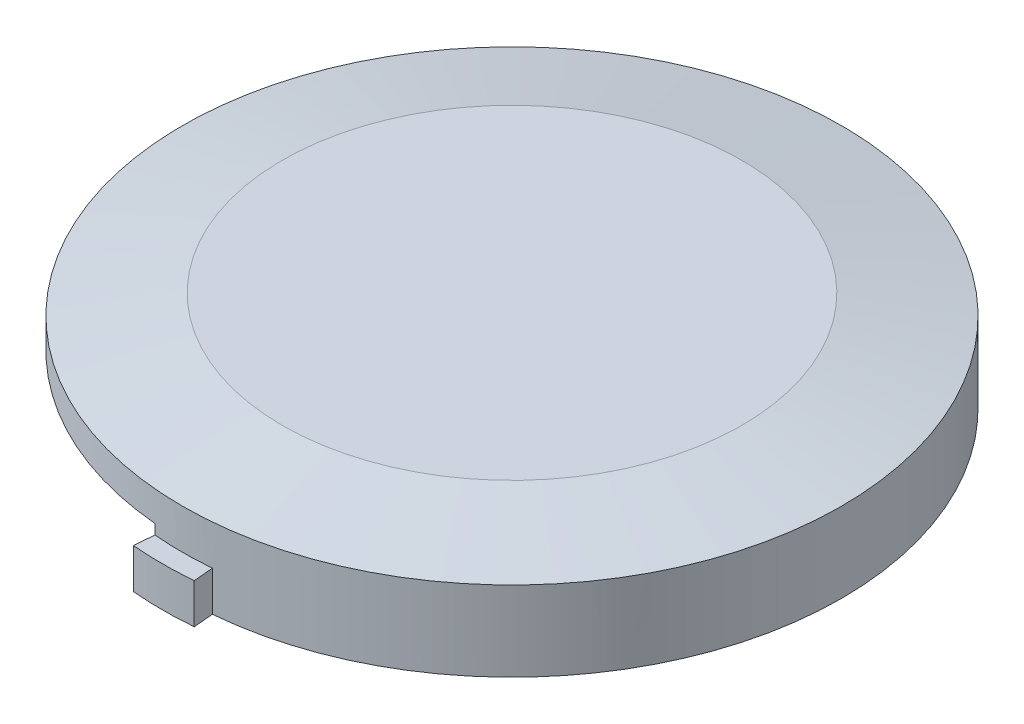
ISO-10303-21;
HEADER;
FILE_DESCRIPTION(('STEP AP214'),'2;1');
FILE_NAME('part.step','',(''),(''),'','','');
FILE_SCHEMA(('AUTOMOTIVE_DESIGN { 1 0 10303 214 1 1 1 1 }'));
ENDSEC;
DATA;
#1=APPLICATION_CONTEXT('core data for automotive mechanical design processes');
#2=APPLICATION_PROTOCOL_DEFINITION('international standard','automotive_design',2000,#1);
#3=PRODUCT_CONTEXT('',#1,'mechanical');
#4=PRODUCT('Part','Part','',(#3));
#5=PRODUCT_RELATED_PRODUCT_CATEGORY('part','',(#4));
#6=PRODUCT_DEFINITION_FORMATION('','',#4);
#7=PRODUCT_DEFINITION_CONTEXT('part definition',#1,'design');
#8=PRODUCT_DEFINITION('design','',#6,#7);
#9=PRODUCT_DEFINITION_SHAPE('','',#8);
#10=(LENGTH_UNIT() NAMED_UNIT(*) SI_UNIT(.MILLI.,.METRE.));
#11=(NAMED_UNIT(*) PLANE_ANGLE_UNIT() SI_UNIT($,.RADIAN.));
#12=(NAMED_UNIT(*) SI_UNIT($,.STERADIAN.) SOLID_ANGLE_UNIT());
#13=UNCERTAINTY_MEASURE_WITH_UNIT(LENGTH_MEASURE(1.E-05),#10,'distance_accuracy_value','');
#14=(GEOMETRIC_REPRESENTATION_CONTEXT(3) GLOBAL_UNCERTAINTY_ASSIGNED_CONTEXT((#13)) GLOBAL_UNIT_ASSIGNED_CONTEXT((#10,
#11,#12)) REPRESENTATION_CONTEXT('',''));
#15=CARTESIAN_POINT('',(0.,0.,0.));
#16=DIRECTION('',(0.,0.,1.));
#17=DIRECTION('',(1.,0.,0.));
#18=AXIS2_PLACEMENT_3D('',#15,#16,#17);
#19=CARTESIAN_POINT('',(0.,5.,0.));
#20=DIRECTION('',(0.,-1.,0.));
#21=DIRECTION('',(0.,0.,-1.));
#22=AXIS2_PLACEMENT_3D('',#19,#20,#21);
#23=CYLINDRICAL_SURFACE('',#22,16.5);
#24=CARTESIAN_POINT('',(0.,4.,0.));
#25=DIRECTION('',(0.,1.,0.));
#26=DIRECTION('',(0.,0.,1.));
#27=AXIS2_PLACEMENT_3D('',#24,#25,#26);
#28=CIRCLE('',#27,16.5);
#29=CARTESIAN_POINT('',(0.,4.,16.5));
#30=VERTEX_POINT('',#29);
#31=EDGE_CURVE('E207',#30,#30,#28,.F.);
#32=ORIENTED_EDGE('',*,*,#31,.T.);
#33=EDGE_LOOP('',(#32));
#34=FACE_BOUND('',#33,.T.);
#35=CARTESIAN_POINT('',(0.,2.5,0.));
#36=DIRECTION('',(0.,-1.,0.));
#37=DIRECTION('',(0.,0.,-1.));
#38=AXIS2_PLACEMENT_3D('',#35,#36,#37);
#39=CIRCLE('',#38,16.5);
#40=CARTESIAN_POINT('',(-1.43806975533631,2.5,16.4372125185138));
#41=VERTEX_POINT('',#40);
#42=CARTESIAN_POINT('',(-16.2493279247014,2.5,-2.86519493150436));
#43=VERTEX_POINT('',#42);
#44=EDGE_CURVE('E130',#41,#43,#39,.T.);
#45=ORIENTED_EDGE('',*,*,#44,.F.);
#46=DIRECTION('',(0.,-1.,0.));
#47=VECTOR('',#46,1.);
#48=CARTESIAN_POINT('',(-1.43806975533631,0.,16.4372125185138));
#49=LINE('',#48,#47);
#50=CARTESIAN_POINT('',(-1.43806975533631,2.,16.4372125185138));
#51=VERTEX_POINT('',#50);
#52=EDGE_CURVE('E136',#41,#51,#49,.T.);
#53=ORIENTED_EDGE('',*,*,#52,.T.);
#54=CARTESIAN_POINT('',(0.,2.,0.));
#55=DIRECTION('',(0.,-1.,0.));
#56=DIRECTION('',(0.,0.,-1.));
#57=AXIS2_PLACEMENT_3D('',#54,#55,#56);
#58=CIRCLE('',#57,16.5);
#59=CARTESIAN_POINT('',(1.43806975533636,1.99999999999999,16.4372125185138));
#60=VERTEX_POINT('',#59);
#61=EDGE_CURVE('E50',#60,#51,#58,.T.);
#62=ORIENTED_EDGE('',*,*,#61,.F.);
#63=DIRECTION('',(0.,1.,0.));
#64=VECTOR('',#63,1.);
#65=CARTESIAN_POINT('',(1.43806975533636,0.,16.4372125185138));
#66=LINE('',#65,#64);
#67=CARTESIAN_POINT('',(1.43806975533636,0.,16.4372125185138));
#68=VERTEX_POINT('',#67);
#69=EDGE_CURVE('E153',#68,#60,#66,.T.);
#70=ORIENTED_EDGE('',*,*,#69,.F.);
#71=CARTESIAN_POINT('',(0.,0.,0.));
#72=DIRECTION('',(0.,1.,0.));
#73=DIRECTION('',(0.,0.,1.));
#74=AXIS2_PLACEMENT_3D('',#71,#72,#73);
#75=CIRCLE('',#74,16.5);
#76=CARTESIAN_POINT('',(1.43806975533636,0.,-16.4372125185138));
#77=VERTEX_POINT('',#76);
#78=EDGE_CURVE('E200',#68,#77,#75,.T.);
#79=ORIENTED_EDGE('',*,*,#78,.T.);
#80=DIRECTION('',(0.,-1.,0.));
#81=VECTOR('',#80,1.);
#82=CARTESIAN_POINT('',(1.43806975533636,0.,-16.4372125185138));
#83=LINE('',#82,#81);
#84=CARTESIAN_POINT('',(1.43806975533636,2.,-16.4372125185138));
#85=VERTEX_POINT('',#84);
#86=EDGE_CURVE('E169',#85,#77,#83,.T.);
#87=ORIENTED_EDGE('',*,*,#86,.F.);
#88=CARTESIAN_POINT('',(0.,2.,0.));
#89=DIRECTION('',(0.,-1.,0.));
#90=DIRECTION('',(0.,0.,-1.));
#91=AXIS2_PLACEMENT_3D('',#88,#89,#90);
#92=CIRCLE('',#91,16.5);
#93=CARTESIAN_POINT('',(-1.43806975533636,2.,-16.4372125185138));
#94=VERTEX_POINT('',#93);
#95=EDGE_CURVE('E57',#94,#85,#92,.T.);
#96=ORIENTED_EDGE('',*,*,#95,.F.);
#97=DIRECTION('',(0.,-1.,0.));
#98=VECTOR('',#97,1.);
#99=CARTESIAN_POINT('',(-1.43806975533636,0.,-16.4372125185138));
#100=LINE('',#99,#98);
#101=CARTESIAN_POINT('',(-1.43806975533636,0.,-16.4372125185138));
#102=VERTEX_POINT('',#101);
#103=EDGE_CURVE('E181',#94,#102,#100,.T.);
#104=ORIENTED_EDGE('',*,*,#103,.T.);
#105=CARTESIAN_POINT('',(-16.2493279247014,0.,-2.86519493150436));
#106=VERTEX_POINT('',#105);
#107=EDGE_CURVE('E139',#102,#106,#75,.T.);
#108=ORIENTED_EDGE('',*,*,#107,.T.);
#109=DIRECTION('',(0.,-1.,0.));
#110=VECTOR('',#109,1.);
#111=CARTESIAN_POINT('',(-16.2493279247014,0.,-2.86519493150436));
#112=LINE('',#111,#110);
#113=EDGE_CURVE('E122',#43,#106,#112,.T.);
#114=ORIENTED_EDGE('',*,*,#113,.F.);
#115=EDGE_LOOP('',(#45,#53,#62,#70,#79,#87,#96,#104,#108,#114));
#116=FACE_BOUND('',#115,.T.);
#117=ADVANCED_FACE('F35',(#34,#116),#23,.T.);
#118=CARTESIAN_POINT('',(0.,5.,0.));
#119=DIRECTION('',(0.,1.,0.));
#120=DIRECTION('',(0.,0.,1.));
#121=AXIS2_PLACEMENT_3D('',#118,#119,#120);
#122=PLANE('',#121);
#123=CARTESIAN_POINT('',(0.,5.,0.));
#124=DIRECTION('',(0.,1.,0.));
#125=DIRECTION('',(0.,0.,1.));
#126=AXIS2_PLACEMENT_3D('',#123,#124,#125);
#127=CIRCLE('',#126,11.4999999999999);
#128=CARTESIAN_POINT('',(0.,5.,11.4999999999999));
#129=VERTEX_POINT('',#128);
#130=EDGE_CURVE('E204',#129,#129,#127,.T.);
#131=ORIENTED_EDGE('',*,*,#130,.T.);
#132=EDGE_LOOP('',(#131));
#133=FACE_BOUND('',#132,.T.);
#134=ADVANCED_FACE('F255',(#133),#122,.T.);
#135=CARTESIAN_POINT('',(0.,0.,0.));
#136=DIRECTION('',(0.,1.,0.));
#137=DIRECTION('',(0.,0.,1.));
#138=AXIS2_PLACEMENT_3D('',#135,#136,#137);
#139=PLANE('',#138);
#140=DIRECTION('',(0.0871557427476584,0.,-0.996194698091746));
#141=VECTOR('',#140,1.);
#142=CARTESIAN_POINT('',(-1.43806975533636,0.,16.4372125185138));
#143=LINE('',#142,#141);
#144=CARTESIAN_POINT('',(-1.52522549808402,0.,17.4334072166055));
#145=VERTEX_POINT('',#144);
#146=CARTESIAN_POINT('',(-1.17660252709334,0.,13.4486284242386));
#147=VERTEX_POINT('',#146);
#148=EDGE_CURVE('E151',#145,#147,#143,.T.);
#149=ORIENTED_EDGE('',*,*,#148,.T.);
#150=CARTESIAN_POINT('',(0.,0.,0.));
#151=DIRECTION('',(0.,1.,0.));
#152=DIRECTION('',(0.,0.,1.));
#153=AXIS2_PLACEMENT_3D('',#150,#151,#152);
#154=CIRCLE('',#153,13.5);
#155=CARTESIAN_POINT('',(-13.2949046656648,0.,-2.34425039850356));
#156=VERTEX_POINT('',#155);
#157=EDGE_CURVE('E196',#147,#156,#154,.T.);
#158=ORIENTED_EDGE('',*,*,#157,.T.);
#159=DIRECTION('',(0.984807753012208,0.,0.173648177666931));
#160=VECTOR('',#159,1.);
#161=CARTESIAN_POINT('',(0.,0.,0.));
#162=LINE('',#161,#160);
#163=EDGE_CURVE('E140',#106,#156,#162,.T.);
#164=ORIENTED_EDGE('',*,*,#163,.F.);
#165=ORIENTED_EDGE('',*,*,#107,.F.);
#166=DIRECTION('',(-0.0871557427476583,0.,-0.996194698091746));
#167=VECTOR('',#166,1.);
#168=CARTESIAN_POINT('',(-1.43806975533636,0.,-16.4372125185138));
#169=LINE('',#168,#167);
#170=CARTESIAN_POINT('',(-1.52522549808402,0.,-17.4334072166055));
#171=VERTEX_POINT('',#170);
#172=EDGE_CURVE('E183',#102,#171,#169,.T.);
#173=ORIENTED_EDGE('',*,*,#172,.T.);
#174=CARTESIAN_POINT('',(0.,0.,0.));
#175=DIRECTION('',(0.,-1.,0.));
#176=DIRECTION('',(0.,0.,-1.));
#177=AXIS2_PLACEMENT_3D('',#174,#175,#176);
#178=CIRCLE('',#177,17.5);
#179=CARTESIAN_POINT('',(1.52522549808402,0.,-17.4334072166055));
#180=VERTEX_POINT('',#179);
#181=EDGE_CURVE('E191',#171,#180,#178,.T.);
#182=ORIENTED_EDGE('',*,*,#181,.T.);
#183=DIRECTION('',(0.0871557427476584,0.,-0.996194698091746));
#184=VECTOR('',#183,1.);
#185=CARTESIAN_POINT('',(1.43806975533636,0.,-16.4372125185138));
#186=LINE('',#185,#184);
#187=EDGE_CURVE('E172',#77,#180,#186,.T.);
#188=ORIENTED_EDGE('',*,*,#187,.F.);
#189=ORIENTED_EDGE('',*,*,#78,.F.);
#190=DIRECTION('',(-0.0871557427476583,0.,-0.996194698091746));
#191=VECTOR('',#190,1.);
#192=CARTESIAN_POINT('',(1.43806975533636,0.,16.4372125185138));
#193=LINE('',#192,#191);
#194=CARTESIAN_POINT('',(1.52522549808402,0.,17.4334072166055));
#195=VERTEX_POINT('',#194);
#196=EDGE_CURVE('E161',#195,#68,#193,.T.);
#197=ORIENTED_EDGE('',*,*,#196,.F.);
#198=CARTESIAN_POINT('',(0.,0.,0.));
#199=DIRECTION('',(0.,-1.,0.));
#200=DIRECTION('',(0.,0.,-1.));
#201=AXIS2_PLACEMENT_3D('',#198,#199,#200);
#202=CIRCLE('',#201,17.5);
#203=EDGE_CURVE('E164',#195,#145,#202,.T.);
#204=ORIENTED_EDGE('',*,*,#203,.T.);
#205=EDGE_LOOP('',(#149,#158,#164,#165,#173,#182,#188,#189,#197,#204));
#206=FACE_BOUND('',#205,.T.);
#207=ADVANCED_FACE('F230',(#206),#139,.F.);
#208=CARTESIAN_POINT('',(0.,5.,0.));
#209=DIRECTION('',(0.,-1.,0.));
#210=DIRECTION('',(0.,0.,-1.));
#211=AXIS2_PLACEMENT_3D('',#208,#209,#210);
#212=CONICAL_SURFACE('',#211,11.4999999999999,1.37340076694502);
#213=ORIENTED_EDGE('',*,*,#31,.F.);
#214=EDGE_LOOP('',(#213));
#215=FACE_BOUND('',#214,.T.);
#216=ORIENTED_EDGE('',*,*,#130,.F.);
#217=EDGE_LOOP('',(#216));
#218=FACE_BOUND('',#217,.T.);
#219=ADVANCED_FACE('F37',(#215,#218),#212,.T.);
#220=CARTESIAN_POINT('',(0.,2.8,0.));
#221=DIRECTION('',(0.,-1.,0.));
#222=DIRECTION('',(0.,0.,-1.));
#223=AXIS2_PLACEMENT_3D('',#220,#221,#222);
#224=CYLINDRICAL_SURFACE('',#223,13.5);
#225=DIRECTION('',(0.,-1.,0.));
#226=VECTOR('',#225,1.);
#227=CARTESIAN_POINT('',(-1.17660252709334,2.8,13.4486284242386));
#228=LINE('',#227,#226);
#229=CARTESIAN_POINT('',(-1.17660252709334,2.5,13.4486284242386));
#230=VERTEX_POINT('',#229);
#231=EDGE_CURVE('E11',#230,#147,#228,.T.);
#232=ORIENTED_EDGE('',*,*,#231,.F.);
#233=CARTESIAN_POINT('',(0.,2.5,0.));
#234=DIRECTION('',(0.,-1.,0.));
#235=DIRECTION('',(0.,0.,-1.));
#236=AXIS2_PLACEMENT_3D('',#233,#234,#235);
#237=CIRCLE('',#236,13.5);
#238=CARTESIAN_POINT('',(-13.2949046656648,2.5,-2.34425039850356));
#239=VERTEX_POINT('',#238);
#240=EDGE_CURVE('E43',#230,#239,#237,.T.);
#241=ORIENTED_EDGE('',*,*,#240,.T.);
#242=DIRECTION('',(0.,-1.,0.));
#243=VECTOR('',#242,1.);
#244=CARTESIAN_POINT('',(-13.2949046656648,2.8,-2.34425039850356));
#245=LINE('',#244,#243);
#246=EDGE_CURVE('E125',#239,#156,#245,.T.);
#247=ORIENTED_EDGE('',*,*,#246,.T.);
#248=ORIENTED_EDGE('',*,*,#157,.F.);
#249=EDGE_LOOP('',(#232,#241,#247,#248));
#250=FACE_BOUND('',#249,.T.);
#251=CARTESIAN_POINT('',(0.,2.8,0.));
#252=DIRECTION('',(0.,1.,0.));
#253=DIRECTION('',(0.,0.,1.));
#254=AXIS2_PLACEMENT_3D('',#251,#252,#253);
#255=CIRCLE('',#254,13.5);
#256=CARTESIAN_POINT('',(0.,2.8,13.5));
#257=VERTEX_POINT('',#256);
#258=EDGE_CURVE('E197',#257,#257,#255,.T.);
#259=ORIENTED_EDGE('',*,*,#258,.T.);
#260=EDGE_LOOP('',(#259));
#261=FACE_BOUND('',#260,.T.);
#262=ADVANCED_FACE('F212',(#250,#261),#224,.F.);
#263=CARTESIAN_POINT('',(0.,2.8,0.));
#264=DIRECTION('',(0.,1.,0.));
#265=DIRECTION('',(0.,0.,1.));
#266=AXIS2_PLACEMENT_3D('',#263,#264,#265);
#267=PLANE('',#266);
#268=ORIENTED_EDGE('',*,*,#258,.F.);
#269=EDGE_LOOP('',(#268));
#270=FACE_BOUND('',#269,.T.);
#271=ADVANCED_FACE('F267',(#270),#267,.F.);
#272=CARTESIAN_POINT('',(-1.43806975533636,2.,-16.4372125185138));
#273=DIRECTION('',(0.,1.,0.));
#274=DIRECTION('',(0.,0.,1.));
#275=AXIS2_PLACEMENT_3D('',#272,#273,#274);
#276=PLANE('',#275);
#277=CARTESIAN_POINT('',(0.,2.,0.));
#278=DIRECTION('',(0.,-1.,0.));
#279=DIRECTION('',(0.,0.,-1.));
#280=AXIS2_PLACEMENT_3D('',#277,#278,#279);
#281=CIRCLE('',#280,17.5);
#282=CARTESIAN_POINT('',(-1.52522549808402,2.,-17.4334072166055));
#283=VERTEX_POINT('',#282);
#284=CARTESIAN_POINT('',(1.52522549808402,2.,-17.4334072166055));
#285=VERTEX_POINT('',#284);
#286=EDGE_CURVE('E193',#283,#285,#281,.T.);
#287=ORIENTED_EDGE('',*,*,#286,.F.);
#288=DIRECTION('',(0.0871557427476583,0.,0.996194698091746));
#289=VECTOR('',#288,1.);
#290=CARTESIAN_POINT('',(-1.43806975533636,2.,-16.4372125185138));
#291=LINE('',#290,#289);
#292=EDGE_CURVE('E189',#283,#94,#291,.T.);
#293=ORIENTED_EDGE('',*,*,#292,.T.);
#294=ORIENTED_EDGE('',*,*,#95,.T.);
#295=DIRECTION('',(-0.0871557427476584,0.,0.996194698091746));
#296=VECTOR('',#295,1.);
#297=CARTESIAN_POINT('',(1.43806975533636,2.,-16.4372125185138));
#298=LINE('',#297,#296);
#299=EDGE_CURVE('E178',#285,#85,#298,.T.);
#300=ORIENTED_EDGE('',*,*,#299,.F.);
#301=EDGE_LOOP('',(#287,#293,#294,#300));
#302=FACE_BOUND('',#301,.T.);
#303=ADVANCED_FACE('F235',(#302),#276,.T.);
#304=CARTESIAN_POINT('',(0.,0.,0.));
#305=DIRECTION('',(0.,-1.,0.));
#306=DIRECTION('',(0.,0.,-1.));
#307=AXIS2_PLACEMENT_3D('',#304,#305,#306);
#308=CYLINDRICAL_SURFACE('',#307,17.5);
#309=ORIENTED_EDGE('',*,*,#181,.F.);
#310=DIRECTION('',(0.,1.,0.));
#311=VECTOR('',#310,1.);
#312=CARTESIAN_POINT('',(-1.52522549808402,0.,-17.4334072166055));
#313=LINE('',#312,#311);
#314=EDGE_CURVE('E186',#171,#283,#313,.T.);
#315=ORIENTED_EDGE('',*,*,#314,.T.);
#316=ORIENTED_EDGE('',*,*,#286,.T.);
#317=DIRECTION('',(0.,1.,0.));
#318=VECTOR('',#317,1.);
#319=CARTESIAN_POINT('',(1.52522549808402,0.,-17.4334072166055));
#320=LINE('',#319,#318);
#321=EDGE_CURVE('E175',#180,#285,#320,.T.);
#322=ORIENTED_EDGE('',*,*,#321,.F.);
#323=EDGE_LOOP('',(#309,#315,#316,#322));
#324=FACE_BOUND('',#323,.T.);
#325=ADVANCED_FACE('F241',(#324),#308,.T.);
#326=CARTESIAN_POINT('',(0.,0.,0.));
#327=DIRECTION('',(-0.996194698091746,0.,0.0871557427476583));
#328=DIRECTION('',(0.0871557427476583,0.,0.996194698091746));
#329=AXIS2_PLACEMENT_3D('',#326,#327,#328);
#330=PLANE('',#329);
#331=ORIENTED_EDGE('',*,*,#103,.F.);
#332=ORIENTED_EDGE('',*,*,#292,.F.);
#333=ORIENTED_EDGE('',*,*,#314,.F.);
#334=ORIENTED_EDGE('',*,*,#172,.F.);
#335=EDGE_LOOP('',(#331,#332,#333,#334));
#336=FACE_BOUND('',#335,.T.);
#337=ADVANCED_FACE('F245',(#336),#330,.T.);
#338=CARTESIAN_POINT('',(0.,0.,0.));
#339=DIRECTION('',(-0.996194698091746,0.,-0.0871557427476584));
#340=DIRECTION('',(-0.0871557427476584,0.,0.996194698091746));
#341=AXIS2_PLACEMENT_3D('',#338,#339,#340);
#342=PLANE('',#341);
#343=ORIENTED_EDGE('',*,*,#86,.T.);
#344=ORIENTED_EDGE('',*,*,#187,.T.);
#345=ORIENTED_EDGE('',*,*,#321,.T.);
#346=ORIENTED_EDGE('',*,*,#299,.T.);
#347=EDGE_LOOP('',(#343,#344,#345,#346));
#348=FACE_BOUND('',#347,.T.);
#349=ADVANCED_FACE('F238',(#348),#342,.F.);
#350=CARTESIAN_POINT('',(1.43806975533636,2.,16.4372125185138));
#351=DIRECTION('',(0.,-1.,0.));
#352=DIRECTION('',(0.,0.,-1.));
#353=AXIS2_PLACEMENT_3D('',#350,#351,#352);
#354=PLANE('',#353);
#355=CARTESIAN_POINT('',(0.,2.,0.));
#356=DIRECTION('',(0.,-1.,0.));
#357=DIRECTION('',(0.,0.,-1.));
#358=AXIS2_PLACEMENT_3D('',#355,#356,#357);
#359=CIRCLE('',#358,17.5);
#360=CARTESIAN_POINT('',(1.52522549808402,2.,17.4334072166055));
#361=VERTEX_POINT('',#360);
#362=CARTESIAN_POINT('',(-1.52522549808402,2.,17.4334072166055));
#363=VERTEX_POINT('',#362);
#364=EDGE_CURVE('E166',#361,#363,#359,.T.);
#365=ORIENTED_EDGE('',*,*,#364,.F.);
#366=DIRECTION('',(0.0871557427476583,0.,0.996194698091746));
#367=VECTOR('',#366,1.);
#368=CARTESIAN_POINT('',(1.43806975533636,2.,16.4372125185138));
#369=LINE('',#368,#367);
#370=EDGE_CURVE('E155',#60,#361,#369,.T.);
#371=ORIENTED_EDGE('',*,*,#370,.F.);
#372=ORIENTED_EDGE('',*,*,#61,.T.);
#373=DIRECTION('',(-0.0871557427476584,0.,0.996194698091746));
#374=VECTOR('',#373,1.);
#375=CARTESIAN_POINT('',(-1.43806975533636,2.,16.4372125185138));
#376=LINE('',#375,#374);
#377=EDGE_CURVE('E135',#51,#363,#376,.T.);
#378=ORIENTED_EDGE('',*,*,#377,.T.);
#379=EDGE_LOOP('',(#365,#371,#372,#378));
#380=FACE_BOUND('',#379,.T.);
#381=ADVANCED_FACE('F222',(#380),#354,.F.);
#382=CARTESIAN_POINT('',(0.,0.,0.));
#383=DIRECTION('',(0.,-1.,0.));
#384=DIRECTION('',(0.,0.,-1.));
#385=AXIS2_PLACEMENT_3D('',#382,#383,#384);
#386=CYLINDRICAL_SURFACE('',#385,17.5);
#387=ORIENTED_EDGE('',*,*,#203,.F.);
#388=DIRECTION('',(0.,-1.,0.));
#389=VECTOR('',#388,1.);
#390=CARTESIAN_POINT('',(1.52522549808402,0.,17.4334072166055));
#391=LINE('',#390,#389);
#392=EDGE_CURVE('E158',#361,#195,#391,.T.);
#393=ORIENTED_EDGE('',*,*,#392,.F.);
#394=ORIENTED_EDGE('',*,*,#364,.T.);
#395=DIRECTION('',(0.,-1.,0.));
#396=VECTOR('',#395,1.);
#397=CARTESIAN_POINT('',(-1.52522549808402,0.,17.4334072166055));
#398=LINE('',#397,#396);
#399=EDGE_CURVE('E148',#363,#145,#398,.T.);
#400=ORIENTED_EDGE('',*,*,#399,.T.);
#401=EDGE_LOOP('',(#387,#393,#394,#400));
#402=FACE_BOUND('',#401,.T.);
#403=ADVANCED_FACE('F228',(#402),#386,.T.);
#404=CARTESIAN_POINT('',(0.,0.,0.));
#405=DIRECTION('',(0.996194698091746,0.,-0.0871557427476583));
#406=DIRECTION('',(-0.0871557427476583,0.,-0.996194698091746));
#407=AXIS2_PLACEMENT_3D('',#404,#405,#406);
#408=PLANE('',#407);
#409=ORIENTED_EDGE('',*,*,#69,.T.);
#410=ORIENTED_EDGE('',*,*,#370,.T.);
#411=ORIENTED_EDGE('',*,*,#392,.T.);
#412=ORIENTED_EDGE('',*,*,#196,.T.);
#413=EDGE_LOOP('',(#409,#410,#411,#412));
#414=FACE_BOUND('',#413,.T.);
#415=ADVANCED_FACE('F225',(#414),#408,.T.);
#416=CARTESIAN_POINT('',(0.,0.,0.));
#417=DIRECTION('',(0.996194698091746,0.,0.0871557427476584));
#418=DIRECTION('',(0.0871557427476584,0.,-0.996194698091746));
#419=AXIS2_PLACEMENT_3D('',#416,#417,#418);
#420=PLANE('',#419);
#421=ORIENTED_EDGE('',*,*,#377,.F.);
#422=ORIENTED_EDGE('',*,*,#52,.F.);
#423=DIRECTION('',(-0.0871557427476549,0.,0.996194698091746));
#424=VECTOR('',#423,1.);
#425=CARTESIAN_POINT('',(0.,2.5,0.));
#426=LINE('',#425,#424);
#427=EDGE_CURVE('E133',#230,#41,#426,.T.);
#428=ORIENTED_EDGE('',*,*,#427,.F.);
#429=ORIENTED_EDGE('',*,*,#231,.T.);
#430=ORIENTED_EDGE('',*,*,#148,.F.);
#431=ORIENTED_EDGE('',*,*,#399,.F.);
#432=EDGE_LOOP('',(#421,#422,#428,#429,#430,#431));
#433=FACE_BOUND('',#432,.T.);
#434=ADVANCED_FACE('F217',(#433),#420,.F.);
#435=CARTESIAN_POINT('',(0.,2.5,0.));
#436=DIRECTION('',(0.,-1.,0.));
#437=DIRECTION('',(0.,0.,-1.));
#438=AXIS2_PLACEMENT_3D('',#435,#436,#437);
#439=PLANE('',#438);
#440=ORIENTED_EDGE('',*,*,#427,.T.);
#441=ORIENTED_EDGE('',*,*,#44,.T.);
#442=DIRECTION('',(-0.984807753012208,0.,-0.173648177666931));
#443=VECTOR('',#442,1.);
#444=CARTESIAN_POINT('',(0.,2.5,0.));
#445=LINE('',#444,#443);
#446=EDGE_CURVE('E118',#239,#43,#445,.T.);
#447=ORIENTED_EDGE('',*,*,#446,.F.);
#448=ORIENTED_EDGE('',*,*,#240,.F.);
#449=EDGE_LOOP('',(#440,#441,#447,#448));
#450=FACE_BOUND('',#449,.T.);
#451=ADVANCED_FACE('F131',(#450),#439,.T.);
#452=CARTESIAN_POINT('',(0.,0.,0.));
#453=DIRECTION('',(-0.173648177666931,0.,0.984807753012208));
#454=DIRECTION('',(0.984807753012208,0.,0.173648177666931));
#455=AXIS2_PLACEMENT_3D('',#452,#453,#454);
#456=PLANE('',#455);
#457=ORIENTED_EDGE('',*,*,#446,.T.);
#458=ORIENTED_EDGE('',*,*,#113,.T.);
#459=ORIENTED_EDGE('',*,*,#163,.T.);
#460=ORIENTED_EDGE('',*,*,#246,.F.);
#461=EDGE_LOOP('',(#457,#458,#459,#460));
#462=FACE_BOUND('',#461,.T.);
#463=ADVANCED_FACE('F120',(#462),#456,.T.);
#464=CLOSED_SHELL('',(#117,#134,#207,#219,#262,#271,#303,#325,#337,#349,#381,#403,#415,#434,
#451,#463));
#465=MANIFOLD_SOLID_BREP('B2',#464);
#466=ADVANCED_BREP_SHAPE_REPRESENTATION('',(#18,#465),#14);
#467=SHAPE_DEFINITION_REPRESENTATION(#9,#466);
ENDSEC;
END-ISO-10303-21;
